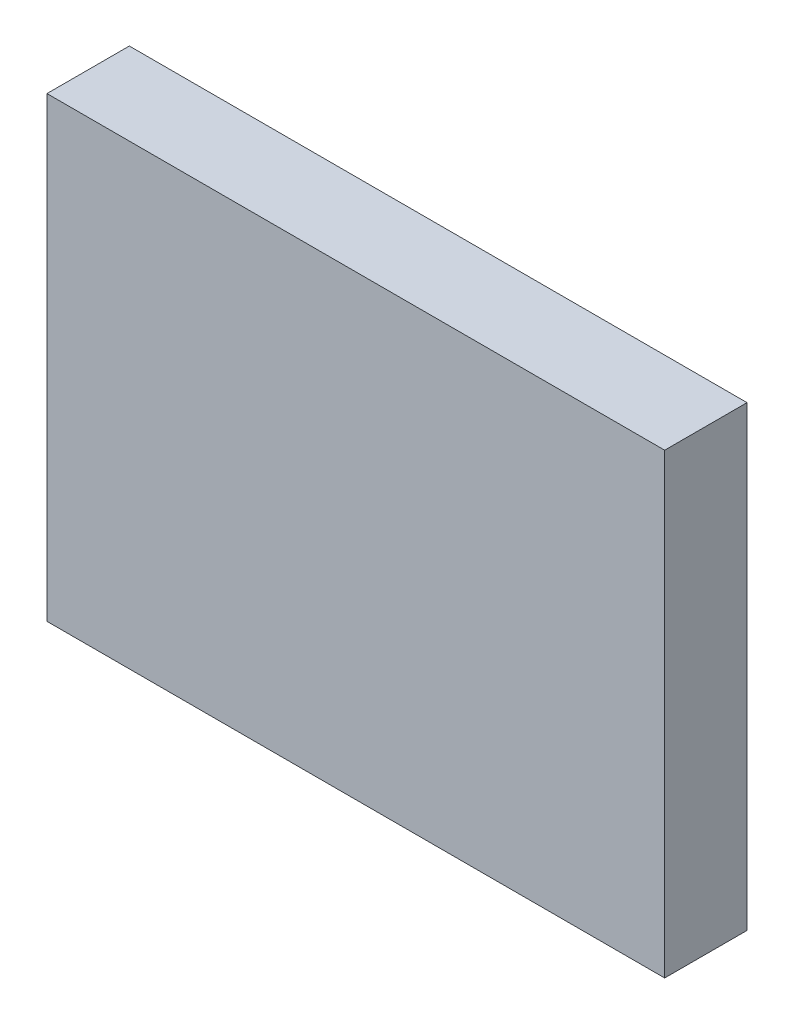
ISO-10303-21;
HEADER;
FILE_DESCRIPTION(('STEP AP214'),'2;1');
FILE_NAME('part.step','',(''),(''),'','','');
FILE_SCHEMA(('AUTOMOTIVE_DESIGN { 1 0 10303 214 1 1 1 1 }'));
ENDSEC;
DATA;
#1=APPLICATION_CONTEXT('core data for automotive mechanical design processes');
#2=APPLICATION_PROTOCOL_DEFINITION('international standard','automotive_design',2000,#1);
#3=PRODUCT_CONTEXT('',#1,'mechanical');
#4=PRODUCT('Part','Part','',(#3));
#5=PRODUCT_RELATED_PRODUCT_CATEGORY('part','',(#4));
#6=PRODUCT_DEFINITION_FORMATION('','',#4);
#7=PRODUCT_DEFINITION_CONTEXT('part definition',#1,'design');
#8=PRODUCT_DEFINITION('design','',#6,#7);
#9=PRODUCT_DEFINITION_SHAPE('','',#8);
#10=(LENGTH_UNIT() NAMED_UNIT(*) SI_UNIT(.MILLI.,.METRE.));
#11=(NAMED_UNIT(*) PLANE_ANGLE_UNIT() SI_UNIT($,.RADIAN.));
#12=(NAMED_UNIT(*) SI_UNIT($,.STERADIAN.) SOLID_ANGLE_UNIT());
#13=UNCERTAINTY_MEASURE_WITH_UNIT(LENGTH_MEASURE(1.E-05),#10,'distance_accuracy_value','');
#14=(GEOMETRIC_REPRESENTATION_CONTEXT(3) GLOBAL_UNCERTAINTY_ASSIGNED_CONTEXT((#13)) GLOBAL_UNIT_ASSIGNED_CONTEXT((#10,
#11,#12)) REPRESENTATION_CONTEXT('',''));
#15=CARTESIAN_POINT('',(0.,0.,0.));
#16=DIRECTION('',(0.,0.,1.));
#17=DIRECTION('',(1.,0.,0.));
#18=AXIS2_PLACEMENT_3D('',#15,#16,#17);
#19=CARTESIAN_POINT('',(75.2088593934475,45.2446871310508,20.));
#20=DIRECTION('',(0.,-1.,0.));
#21=DIRECTION('',(1.,0.,0.));
#22=AXIS2_PLACEMENT_3D('',#19,#20,#21);
#23=PLANE('',#22);
#24=DIRECTION('',(-1.,0.,0.));
#25=VECTOR('',#24,1.);
#26=CARTESIAN_POINT('',(75.2088593934475,45.2446871310508,0.));
#27=LINE('',#26,#25);
#28=CARTESIAN_POINT('',(75.2088593934475,45.2446871310508,0.));
#29=VERTEX_POINT('',#28);
#30=CARTESIAN_POINT('',(-74.7911406065525,45.2446871310508,0.));
#31=VERTEX_POINT('',#30);
#32=EDGE_CURVE('E96',#29,#31,#27,.T.);
#33=ORIENTED_EDGE('',*,*,#32,.T.);
#34=DIRECTION('',(0.,0.,-1.));
#35=VECTOR('',#34,1.);
#36=CARTESIAN_POINT('',(-74.7911406065525,45.2446871310508,20.));
#37=LINE('',#36,#35);
#38=CARTESIAN_POINT('',(-74.7911406065525,45.2446871310508,20.));
#39=VERTEX_POINT('',#38);
#40=EDGE_CURVE('E11',#39,#31,#37,.T.);
#41=ORIENTED_EDGE('',*,*,#40,.F.);
#42=DIRECTION('',(-1.,0.,0.));
#43=VECTOR('',#42,1.);
#44=CARTESIAN_POINT('',(75.2088593934475,45.2446871310508,20.));
#45=LINE('',#44,#43);
#46=CARTESIAN_POINT('',(75.2088593934475,45.2446871310508,20.));
#47=VERTEX_POINT('',#46);
#48=EDGE_CURVE('E84',#47,#39,#45,.T.);
#49=ORIENTED_EDGE('',*,*,#48,.F.);
#50=DIRECTION('',(0.,0.,-1.));
#51=VECTOR('',#50,1.);
#52=CARTESIAN_POINT('',(75.2088593934475,45.2446871310508,20.));
#53=LINE('',#52,#51);
#54=EDGE_CURVE('E92',#47,#29,#53,.T.);
#55=ORIENTED_EDGE('',*,*,#54,.T.);
#56=EDGE_LOOP('',(#33,#41,#49,#55));
#57=FACE_BOUND('',#56,.T.);
#58=ADVANCED_FACE('F33',(#57),#23,.F.);
#59=CARTESIAN_POINT('',(-74.7911406065525,45.2446871310508,20.));
#60=DIRECTION('',(1.,0.,0.));
#61=DIRECTION('',(0.,1.,0.));
#62=AXIS2_PLACEMENT_3D('',#59,#60,#61);
#63=PLANE('',#62);
#64=DIRECTION('',(0.,-1.,0.));
#65=VECTOR('',#64,1.);
#66=CARTESIAN_POINT('',(-74.7911406065525,45.2446871310508,0.));
#67=LINE('',#66,#65);
#68=CARTESIAN_POINT('',(-74.7911406065525,-65.7553128689492,0.));
#69=VERTEX_POINT('',#68);
#70=EDGE_CURVE('E88',#31,#69,#67,.T.);
#71=ORIENTED_EDGE('',*,*,#70,.T.);
#72=DIRECTION('',(0.,0.,-1.));
#73=VECTOR('',#72,1.);
#74=CARTESIAN_POINT('',(-74.7911406065525,-65.7553128689492,20.));
#75=LINE('',#74,#73);
#76=CARTESIAN_POINT('',(-74.7911406065525,-65.7553128689492,20.));
#77=VERTEX_POINT('',#76);
#78=EDGE_CURVE('E41',#77,#69,#75,.T.);
#79=ORIENTED_EDGE('',*,*,#78,.F.);
#80=DIRECTION('',(0.,-1.,0.));
#81=VECTOR('',#80,1.);
#82=CARTESIAN_POINT('',(-74.7911406065525,45.2446871310508,20.));
#83=LINE('',#82,#81);
#84=EDGE_CURVE('E79',#39,#77,#83,.T.);
#85=ORIENTED_EDGE('',*,*,#84,.F.);
#86=ORIENTED_EDGE('',*,*,#40,.T.);
#87=EDGE_LOOP('',(#71,#79,#85,#86));
#88=FACE_BOUND('',#87,.T.);
#89=ADVANCED_FACE('F87',(#88),#63,.F.);
#90=CARTESIAN_POINT('',(-74.7911406065525,-65.7553128689492,20.));
#91=DIRECTION('',(0.,1.,0.));
#92=DIRECTION('',(0.,0.,1.));
#93=AXIS2_PLACEMENT_3D('',#90,#91,#92);
#94=PLANE('',#93);
#95=DIRECTION('',(1.,0.,0.));
#96=VECTOR('',#95,1.);
#97=CARTESIAN_POINT('',(-74.7911406065525,-65.7553128689492,0.));
#98=LINE('',#97,#96);
#99=CARTESIAN_POINT('',(75.2088593934475,-65.7553128689492,0.));
#100=VERTEX_POINT('',#99);
#101=EDGE_CURVE('E66',#69,#100,#98,.T.);
#102=ORIENTED_EDGE('',*,*,#101,.T.);
#103=DIRECTION('',(0.,0.,-1.));
#104=VECTOR('',#103,1.);
#105=CARTESIAN_POINT('',(75.2088593934475,-65.7553128689492,20.));
#106=LINE('',#105,#104);
#107=CARTESIAN_POINT('',(75.2088593934475,-65.7553128689492,20.));
#108=VERTEX_POINT('',#107);
#109=EDGE_CURVE('E89',#108,#100,#106,.T.);
#110=ORIENTED_EDGE('',*,*,#109,.F.);
#111=DIRECTION('',(1.,0.,0.));
#112=VECTOR('',#111,1.);
#113=CARTESIAN_POINT('',(-74.7911406065525,-65.7553128689492,20.));
#114=LINE('',#113,#112);
#115=EDGE_CURVE('E82',#77,#108,#114,.T.);
#116=ORIENTED_EDGE('',*,*,#115,.F.);
#117=ORIENTED_EDGE('',*,*,#78,.T.);
#118=EDGE_LOOP('',(#102,#110,#116,#117));
#119=FACE_BOUND('',#118,.T.);
#120=ADVANCED_FACE('F90',(#119),#94,.F.);
#121=CARTESIAN_POINT('',(75.2088593934475,-65.7553128689492,20.));
#122=DIRECTION('',(-1.,0.,0.));
#123=DIRECTION('',(0.,-1.,0.));
#124=AXIS2_PLACEMENT_3D('',#121,#122,#123);
#125=PLANE('',#124);
#126=DIRECTION('',(0.,1.,0.));
#127=VECTOR('',#126,1.);
#128=CARTESIAN_POINT('',(75.2088593934475,-65.7553128689492,0.));
#129=LINE('',#128,#127);
#130=EDGE_CURVE('E72',#100,#29,#129,.T.);
#131=ORIENTED_EDGE('',*,*,#130,.T.);
#132=ORIENTED_EDGE('',*,*,#54,.F.);
#133=DIRECTION('',(0.,1.,0.));
#134=VECTOR('',#133,1.);
#135=CARTESIAN_POINT('',(75.2088593934475,-65.7553128689492,20.));
#136=LINE('',#135,#134);
#137=EDGE_CURVE('E49',#108,#47,#136,.T.);
#138=ORIENTED_EDGE('',*,*,#137,.F.);
#139=ORIENTED_EDGE('',*,*,#109,.T.);
#140=EDGE_LOOP('',(#131,#132,#138,#139));
#141=FACE_BOUND('',#140,.T.);
#142=ADVANCED_FACE('F103',(#141),#125,.F.);
#143=CARTESIAN_POINT('',(0.,0.,20.));
#144=DIRECTION('',(0.,0.,1.));
#145=DIRECTION('',(1.,0.,0.));
#146=AXIS2_PLACEMENT_3D('',#143,#144,#145);
#147=PLANE('',#146);
#148=ORIENTED_EDGE('',*,*,#48,.T.);
#149=ORIENTED_EDGE('',*,*,#84,.T.);
#150=ORIENTED_EDGE('',*,*,#115,.T.);
#151=ORIENTED_EDGE('',*,*,#137,.T.);
#152=EDGE_LOOP('',(#148,#149,#150,#151));
#153=FACE_BOUND('',#152,.T.);
#154=ADVANCED_FACE('F80',(#153),#147,.T.);
#155=CARTESIAN_POINT('',(0.,0.,0.));
#156=DIRECTION('',(0.,0.,1.));
#157=DIRECTION('',(1.,0.,0.));
#158=AXIS2_PLACEMENT_3D('',#155,#156,#157);
#159=PLANE('',#158);
#160=ORIENTED_EDGE('',*,*,#32,.F.);
#161=ORIENTED_EDGE('',*,*,#130,.F.);
#162=ORIENTED_EDGE('',*,*,#101,.F.);
#163=ORIENTED_EDGE('',*,*,#70,.F.);
#164=EDGE_LOOP('',(#160,#161,#162,#163));
#165=FACE_BOUND('',#164,.T.);
#166=ADVANCED_FACE('F106',(#165),#159,.F.);
#167=CLOSED_SHELL('',(#58,#89,#120,#142,#154,#166));
#168=MANIFOLD_SOLID_BREP('B2',#167);
#169=ADVANCED_BREP_SHAPE_REPRESENTATION('',(#18,#168),#14);
#170=SHAPE_DEFINITION_REPRESENTATION(#9,#169);
ENDSEC;
END-ISO-10303-21;
